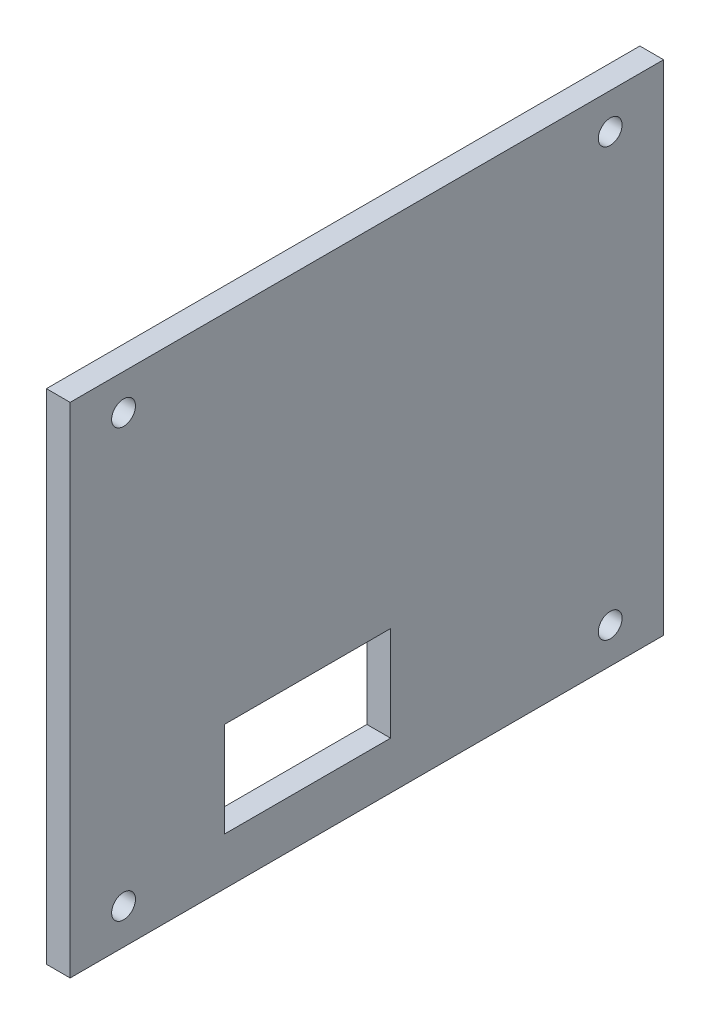
ISO-10303-21;
HEADER;
FILE_DESCRIPTION(('STEP AP214'),'2;1');
FILE_NAME('part.step','',(''),(''),'','','');
FILE_SCHEMA(('AUTOMOTIVE_DESIGN { 1 0 10303 214 1 1 1 1 }'));
ENDSEC;
DATA;
#1=APPLICATION_CONTEXT('core data for automotive mechanical design processes');
#2=APPLICATION_PROTOCOL_DEFINITION('international standard','automotive_design',2000,#1);
#3=PRODUCT_CONTEXT('',#1,'mechanical');
#4=PRODUCT('Part','Part','',(#3));
#5=PRODUCT_RELATED_PRODUCT_CATEGORY('part','',(#4));
#6=PRODUCT_DEFINITION_FORMATION('','',#4);
#7=PRODUCT_DEFINITION_CONTEXT('part definition',#1,'design');
#8=PRODUCT_DEFINITION('design','',#6,#7);
#9=PRODUCT_DEFINITION_SHAPE('','',#8);
#10=(LENGTH_UNIT() NAMED_UNIT(*) SI_UNIT(.MILLI.,.METRE.));
#11=(NAMED_UNIT(*) PLANE_ANGLE_UNIT() SI_UNIT($,.RADIAN.));
#12=(NAMED_UNIT(*) SI_UNIT($,.STERADIAN.) SOLID_ANGLE_UNIT());
#13=UNCERTAINTY_MEASURE_WITH_UNIT(LENGTH_MEASURE(1.E-05),#10,'distance_accuracy_value','');
#14=(GEOMETRIC_REPRESENTATION_CONTEXT(3) GLOBAL_UNCERTAINTY_ASSIGNED_CONTEXT((#13)) GLOBAL_UNIT_ASSIGNED_CONTEXT((#10,
#11,#12)) REPRESENTATION_CONTEXT('',''));
#15=CARTESIAN_POINT('',(0.,0.,0.));
#16=DIRECTION('',(0.,0.,1.));
#17=DIRECTION('',(1.,0.,0.));
#18=AXIS2_PLACEMENT_3D('',#15,#16,#17);
#19=CARTESIAN_POINT('',(2.,-22.,-25.));
#20=DIRECTION('',(0.,0.,1.));
#21=DIRECTION('',(1.,0.,0.));
#22=AXIS2_PLACEMENT_3D('',#19,#20,#21);
#23=PLANE('',#22);
#24=DIRECTION('',(0.,1.,0.));
#25=VECTOR('',#24,1.);
#26=CARTESIAN_POINT('',(2.,-22.,-25.));
#27=LINE('',#26,#25);
#28=CARTESIAN_POINT('',(2.,-21.0008036645774,-25.));
#29=VERTEX_POINT('',#28);
#30=CARTESIAN_POINT('',(2.,21.0015878345331,-25.));
#31=VERTEX_POINT('',#30);
#32=EDGE_CURVE('E113',#29,#31,#27,.T.);
#33=ORIENTED_EDGE('',*,*,#32,.F.);
#34=DIRECTION('',(1.,0.,0.));
#35=VECTOR('',#34,1.);
#36=CARTESIAN_POINT('',(-3.,-21.0008036645774,-25.));
#37=LINE('',#36,#35);
#38=CARTESIAN_POINT('',(0.,-21.0008036645774,-25.));
#39=VERTEX_POINT('',#38);
#40=EDGE_CURVE('E102',#39,#29,#37,.T.);
#41=ORIENTED_EDGE('',*,*,#40,.F.);
#42=DIRECTION('',(0.,1.,0.));
#43=VECTOR('',#42,1.);
#44=CARTESIAN_POINT('',(0.,-22.,-25.));
#45=LINE('',#44,#43);
#46=CARTESIAN_POINT('',(0.,21.0015878345331,-25.));
#47=VERTEX_POINT('',#46);
#48=EDGE_CURVE('E61',#39,#47,#45,.T.);
#49=ORIENTED_EDGE('',*,*,#48,.T.);
#50=DIRECTION('',(1.,0.,0.));
#51=VECTOR('',#50,1.);
#52=CARTESIAN_POINT('',(-3.,21.0015878345331,-25.));
#53=LINE('',#52,#51);
#54=EDGE_CURVE('E119',#47,#31,#53,.T.);
#55=ORIENTED_EDGE('',*,*,#54,.T.);
#56=EDGE_LOOP('',(#33,#41,#49,#55));
#57=FACE_BOUND('',#56,.T.);
#58=ADVANCED_FACE('F39',(#57),#23,.F.);
#59=CARTESIAN_POINT('',(2.,-22.,25.));
#60=DIRECTION('',(0.,0.,-1.));
#61=DIRECTION('',(-1.,0.,0.));
#62=AXIS2_PLACEMENT_3D('',#59,#60,#61);
#63=PLANE('',#62);
#64=DIRECTION('',(0.,-1.,0.));
#65=VECTOR('',#64,1.);
#66=CARTESIAN_POINT('',(0.,-22.,25.));
#67=LINE('',#66,#65);
#68=CARTESIAN_POINT('',(0.,21.0015878345331,25.));
#69=VERTEX_POINT('',#68);
#70=CARTESIAN_POINT('',(0.,-21.0008036645774,25.));
#71=VERTEX_POINT('',#70);
#72=EDGE_CURVE('E121',#69,#71,#67,.T.);
#73=ORIENTED_EDGE('',*,*,#72,.T.);
#74=DIRECTION('',(1.,0.,0.));
#75=VECTOR('',#74,1.);
#76=CARTESIAN_POINT('',(-3.,-21.0008036645774,25.));
#77=LINE('',#76,#75);
#78=CARTESIAN_POINT('',(2.,-21.0008036645774,25.));
#79=VERTEX_POINT('',#78);
#80=EDGE_CURVE('E53',#71,#79,#77,.T.);
#81=ORIENTED_EDGE('',*,*,#80,.T.);
#82=DIRECTION('',(0.,-1.,0.));
#83=VECTOR('',#82,1.);
#84=CARTESIAN_POINT('',(2.,-22.,25.));
#85=LINE('',#84,#83);
#86=CARTESIAN_POINT('',(2.,21.0015878345331,25.));
#87=VERTEX_POINT('',#86);
#88=EDGE_CURVE('E116',#87,#79,#85,.T.);
#89=ORIENTED_EDGE('',*,*,#88,.F.);
#90=DIRECTION('',(1.,0.,0.));
#91=VECTOR('',#90,1.);
#92=CARTESIAN_POINT('',(-3.,21.0015878345331,25.));
#93=LINE('',#92,#91);
#94=EDGE_CURVE('E139',#69,#87,#93,.T.);
#95=ORIENTED_EDGE('',*,*,#94,.F.);
#96=EDGE_LOOP('',(#73,#81,#89,#95));
#97=FACE_BOUND('',#96,.T.);
#98=ADVANCED_FACE('F143',(#97),#63,.F.);
#99=CARTESIAN_POINT('',(2.,0.,0.));
#100=DIRECTION('',(-1.,0.,0.));
#101=DIRECTION('',(0.,0.,1.));
#102=AXIS2_PLACEMENT_3D('',#99,#100,#101);
#103=PLANE('',#102);
#104=CARTESIAN_POINT('',(2.,-18.,20.4997928754972));
#105=DIRECTION('',(-1.,0.,0.));
#106=DIRECTION('',(0.,0.,1.));
#107=AXIS2_PLACEMENT_3D('',#104,#105,#106);
#108=CIRCLE('',#107,1.00359306352074);
#109=CARTESIAN_POINT('',(2.,-18.,21.5033859390179));
#110=VERTEX_POINT('',#109);
#111=EDGE_CURVE('E180',#110,#110,#108,.T.);
#112=ORIENTED_EDGE('',*,*,#111,.T.);
#113=EDGE_LOOP('',(#112));
#114=FACE_BOUND('',#113,.T.);
#115=CARTESIAN_POINT('',(2.,18.,-20.5002071245028));
#116=DIRECTION('',(-1.,0.,0.));
#117=DIRECTION('',(0.,0.,1.));
#118=AXIS2_PLACEMENT_3D('',#115,#116,#117);
#119=CIRCLE('',#118,1.00359306352074);
#120=CARTESIAN_POINT('',(2.,18.,-19.4966140609821));
#121=VERTEX_POINT('',#120);
#122=EDGE_CURVE('E232',#121,#121,#119,.T.);
#123=ORIENTED_EDGE('',*,*,#122,.T.);
#124=EDGE_LOOP('',(#123));
#125=FACE_BOUND('',#124,.T.);
#126=CARTESIAN_POINT('',(2.,-18.,-20.5002071245028));
#127=DIRECTION('',(-1.,0.,0.));
#128=DIRECTION('',(0.,0.,1.));
#129=AXIS2_PLACEMENT_3D('',#126,#127,#128);
#130=CIRCLE('',#129,1.00359306352074);
#131=CARTESIAN_POINT('',(2.,-18.,-19.4966140609821));
#132=VERTEX_POINT('',#131);
#133=EDGE_CURVE('E233',#132,#132,#130,.T.);
#134=ORIENTED_EDGE('',*,*,#133,.T.);
#135=EDGE_LOOP('',(#134));
#136=FACE_BOUND('',#135,.T.);
#137=CARTESIAN_POINT('',(2.,18.,20.4997928754972));
#138=DIRECTION('',(-1.,0.,0.));
#139=DIRECTION('',(0.,0.,1.));
#140=AXIS2_PLACEMENT_3D('',#137,#138,#139);
#141=CIRCLE('',#140,1.00359306352074);
#142=CARTESIAN_POINT('',(2.,18.,21.5033859390179));
#143=VERTEX_POINT('',#142);
#144=EDGE_CURVE('E133',#143,#143,#141,.T.);
#145=ORIENTED_EDGE('',*,*,#144,.T.);
#146=EDGE_LOOP('',(#145));
#147=FACE_BOUND('',#146,.T.);
#148=DIRECTION('',(0.,0.,-1.));
#149=VECTOR('',#148,1.);
#150=CARTESIAN_POINT('',(2.,-9.00000000000001,12.));
#151=LINE('',#150,#149);
#152=CARTESIAN_POINT('',(2.,-9.00000000000001,12.));
#153=VERTEX_POINT('',#152);
#154=CARTESIAN_POINT('',(2.,-9.00000000000001,-2.00000000000001));
#155=VERTEX_POINT('',#154);
#156=EDGE_CURVE('E189',#153,#155,#151,.T.);
#157=ORIENTED_EDGE('',*,*,#156,.T.);
#158=DIRECTION('',(0.,-1.,0.));
#159=VECTOR('',#158,1.);
#160=CARTESIAN_POINT('',(2.,-17.,-2.00000000000001));
#161=LINE('',#160,#159);
#162=CARTESIAN_POINT('',(2.,-17.,-2.00000000000001));
#163=VERTEX_POINT('',#162);
#164=EDGE_CURVE('E197',#155,#163,#161,.T.);
#165=ORIENTED_EDGE('',*,*,#164,.T.);
#166=DIRECTION('',(0.,0.,1.));
#167=VECTOR('',#166,1.);
#168=CARTESIAN_POINT('',(2.,-17.,12.));
#169=LINE('',#168,#167);
#170=CARTESIAN_POINT('',(2.,-17.,12.));
#171=VERTEX_POINT('',#170);
#172=EDGE_CURVE('E218',#163,#171,#169,.T.);
#173=ORIENTED_EDGE('',*,*,#172,.T.);
#174=DIRECTION('',(0.,1.,0.));
#175=VECTOR('',#174,1.);
#176=CARTESIAN_POINT('',(2.,-17.,12.));
#177=LINE('',#176,#175);
#178=EDGE_CURVE('E212',#171,#153,#177,.T.);
#179=ORIENTED_EDGE('',*,*,#178,.T.);
#180=EDGE_LOOP('',(#157,#165,#173,#179));
#181=FACE_BOUND('',#180,.T.);
#182=ORIENTED_EDGE('',*,*,#88,.T.);
#183=DIRECTION('',(0.,0.,1.));
#184=VECTOR('',#183,1.);
#185=CARTESIAN_POINT('',(2.,-21.0008036645774,25.));
#186=LINE('',#185,#184);
#187=EDGE_CURVE('E105',#29,#79,#186,.T.);
#188=ORIENTED_EDGE('',*,*,#187,.F.);
#189=ORIENTED_EDGE('',*,*,#32,.T.);
#190=DIRECTION('',(0.,0.,-1.));
#191=VECTOR('',#190,1.);
#192=CARTESIAN_POINT('',(2.,21.0015878345331,25.));
#193=LINE('',#192,#191);
#194=EDGE_CURVE('E145',#87,#31,#193,.T.);
#195=ORIENTED_EDGE('',*,*,#194,.F.);
#196=EDGE_LOOP('',(#182,#188,#189,#195));
#197=FACE_BOUND('',#196,.T.);
#198=ADVANCED_FACE('F111',(#114,#125,#136,#147,#181,#197),#103,.F.);
#199=CARTESIAN_POINT('',(0.,0.,0.));
#200=DIRECTION('',(-1.,0.,0.));
#201=DIRECTION('',(0.,0.,1.));
#202=AXIS2_PLACEMENT_3D('',#199,#200,#201);
#203=PLANE('',#202);
#204=DIRECTION('',(0.,0.,-1.));
#205=VECTOR('',#204,1.);
#206=CARTESIAN_POINT('',(0.,-21.0008036645774,0.));
#207=LINE('',#206,#205);
#208=EDGE_CURVE('E11',#71,#39,#207,.T.);
#209=ORIENTED_EDGE('',*,*,#208,.F.);
#210=ORIENTED_EDGE('',*,*,#72,.F.);
#211=DIRECTION('',(0.,0.,1.));
#212=VECTOR('',#211,1.);
#213=CARTESIAN_POINT('',(0.,21.0015878345331,0.));
#214=LINE('',#213,#212);
#215=EDGE_CURVE('E47',#47,#69,#214,.T.);
#216=ORIENTED_EDGE('',*,*,#215,.F.);
#217=ORIENTED_EDGE('',*,*,#48,.F.);
#218=EDGE_LOOP('',(#209,#210,#216,#217));
#219=FACE_BOUND('',#218,.T.);
#220=CARTESIAN_POINT('',(0.,-18.,20.4997928754972));
#221=DIRECTION('',(-1.,0.,0.));
#222=DIRECTION('',(0.,0.,1.));
#223=AXIS2_PLACEMENT_3D('',#220,#221,#222);
#224=CIRCLE('',#223,1.00359306352074);
#225=CARTESIAN_POINT('',(0.,-18.,21.5033859390179));
#226=VERTEX_POINT('',#225);
#227=EDGE_CURVE('E155',#226,#226,#224,.T.);
#228=ORIENTED_EDGE('',*,*,#227,.F.);
#229=EDGE_LOOP('',(#228));
#230=FACE_BOUND('',#229,.T.);
#231=CARTESIAN_POINT('',(0.,18.,-20.5002071245028));
#232=DIRECTION('',(-1.,0.,0.));
#233=DIRECTION('',(0.,0.,1.));
#234=AXIS2_PLACEMENT_3D('',#231,#232,#233);
#235=CIRCLE('',#234,1.00359306352074);
#236=CARTESIAN_POINT('',(0.,18.,-19.4966140609821));
#237=VERTEX_POINT('',#236);
#238=EDGE_CURVE('E159',#237,#237,#235,.T.);
#239=ORIENTED_EDGE('',*,*,#238,.F.);
#240=EDGE_LOOP('',(#239));
#241=FACE_BOUND('',#240,.T.);
#242=CARTESIAN_POINT('',(0.,-18.,-20.5002071245028));
#243=DIRECTION('',(-1.,0.,0.));
#244=DIRECTION('',(0.,0.,1.));
#245=AXIS2_PLACEMENT_3D('',#242,#243,#244);
#246=CIRCLE('',#245,1.00359306352074);
#247=CARTESIAN_POINT('',(0.,-18.,-19.4966140609821));
#248=VERTEX_POINT('',#247);
#249=EDGE_CURVE('E163',#248,#248,#246,.T.);
#250=ORIENTED_EDGE('',*,*,#249,.F.);
#251=EDGE_LOOP('',(#250));
#252=FACE_BOUND('',#251,.T.);
#253=CARTESIAN_POINT('',(0.,18.,20.4997928754972));
#254=DIRECTION('',(-1.,0.,0.));
#255=DIRECTION('',(0.,0.,1.));
#256=AXIS2_PLACEMENT_3D('',#253,#254,#255);
#257=CIRCLE('',#256,1.00359306352074);
#258=CARTESIAN_POINT('',(0.,18.,21.5033859390179));
#259=VERTEX_POINT('',#258);
#260=EDGE_CURVE('E167',#259,#259,#257,.T.);
#261=ORIENTED_EDGE('',*,*,#260,.F.);
#262=EDGE_LOOP('',(#261));
#263=FACE_BOUND('',#262,.T.);
#264=DIRECTION('',(0.,-1.,0.));
#265=VECTOR('',#264,1.);
#266=CARTESIAN_POINT('',(0.,-17.,-2.00000000000001));
#267=LINE('',#266,#265);
#268=CARTESIAN_POINT('',(0.,-9.00000000000001,-2.00000000000001));
#269=VERTEX_POINT('',#268);
#270=CARTESIAN_POINT('',(0.,-17.,-2.00000000000001));
#271=VERTEX_POINT('',#270);
#272=EDGE_CURVE('E171',#269,#271,#267,.T.);
#273=ORIENTED_EDGE('',*,*,#272,.F.);
#274=DIRECTION('',(0.,0.,-1.));
#275=VECTOR('',#274,1.);
#276=CARTESIAN_POINT('',(0.,-9.00000000000001,12.));
#277=LINE('',#276,#275);
#278=CARTESIAN_POINT('',(0.,-9.00000000000001,12.));
#279=VERTEX_POINT('',#278);
#280=EDGE_CURVE('E174',#279,#269,#277,.T.);
#281=ORIENTED_EDGE('',*,*,#280,.F.);
#282=DIRECTION('',(0.,1.,0.));
#283=VECTOR('',#282,1.);
#284=CARTESIAN_POINT('',(0.,-17.,12.));
#285=LINE('',#284,#283);
#286=CARTESIAN_POINT('',(0.,-17.,12.));
#287=VERTEX_POINT('',#286);
#288=EDGE_CURVE('E184',#287,#279,#285,.T.);
#289=ORIENTED_EDGE('',*,*,#288,.F.);
#290=DIRECTION('',(0.,0.,1.));
#291=VECTOR('',#290,1.);
#292=CARTESIAN_POINT('',(0.,-17.,12.));
#293=LINE('',#292,#291);
#294=EDGE_CURVE('E176',#271,#287,#293,.T.);
#295=ORIENTED_EDGE('',*,*,#294,.F.);
#296=EDGE_LOOP('',(#273,#281,#289,#295));
#297=FACE_BOUND('',#296,.T.);
#298=ADVANCED_FACE('F147',(#219,#230,#241,#252,#263,#297),#203,.T.);
#299=CARTESIAN_POINT('',(2.,-17.,-2.00000000000001));
#300=DIRECTION('',(0.,0.,-1.));
#301=DIRECTION('',(-1.,0.,0.));
#302=AXIS2_PLACEMENT_3D('',#299,#300,#301);
#303=PLANE('',#302);
#304=ORIENTED_EDGE('',*,*,#272,.T.);
#305=DIRECTION('',(-1.,0.,0.));
#306=VECTOR('',#305,1.);
#307=CARTESIAN_POINT('',(2.,-17.,-2.00000000000001));
#308=LINE('',#307,#306);
#309=EDGE_CURVE('E129',#163,#271,#308,.T.);
#310=ORIENTED_EDGE('',*,*,#309,.F.);
#311=ORIENTED_EDGE('',*,*,#164,.F.);
#312=DIRECTION('',(-1.,0.,0.));
#313=VECTOR('',#312,1.);
#314=CARTESIAN_POINT('',(2.,-9.00000000000001,-2.00000000000001));
#315=LINE('',#314,#313);
#316=EDGE_CURVE('E198',#155,#269,#315,.T.);
#317=ORIENTED_EDGE('',*,*,#316,.T.);
#318=EDGE_LOOP('',(#304,#310,#311,#317));
#319=FACE_BOUND('',#318,.T.);
#320=ADVANCED_FACE('F150',(#319),#303,.F.);
#321=CARTESIAN_POINT('',(2.,-9.00000000000001,12.));
#322=DIRECTION('',(0.,1.,0.));
#323=DIRECTION('',(0.,0.,1.));
#324=AXIS2_PLACEMENT_3D('',#321,#322,#323);
#325=PLANE('',#324);
#326=ORIENTED_EDGE('',*,*,#280,.T.);
#327=ORIENTED_EDGE('',*,*,#316,.F.);
#328=ORIENTED_EDGE('',*,*,#156,.F.);
#329=DIRECTION('',(-1.,0.,0.));
#330=VECTOR('',#329,1.);
#331=CARTESIAN_POINT('',(2.,-9.00000000000001,12.));
#332=LINE('',#331,#330);
#333=EDGE_CURVE('E201',#153,#279,#332,.T.);
#334=ORIENTED_EDGE('',*,*,#333,.T.);
#335=EDGE_LOOP('',(#326,#327,#328,#334));
#336=FACE_BOUND('',#335,.T.);
#337=ADVANCED_FACE('F277',(#336),#325,.F.);
#338=CARTESIAN_POINT('',(2.,-17.,12.));
#339=DIRECTION('',(0.,0.,1.));
#340=DIRECTION('',(1.,0.,0.));
#341=AXIS2_PLACEMENT_3D('',#338,#339,#340);
#342=PLANE('',#341);
#343=ORIENTED_EDGE('',*,*,#288,.T.);
#344=ORIENTED_EDGE('',*,*,#333,.F.);
#345=ORIENTED_EDGE('',*,*,#178,.F.);
#346=DIRECTION('',(-1.,0.,0.));
#347=VECTOR('',#346,1.);
#348=CARTESIAN_POINT('',(2.,-17.,12.));
#349=LINE('',#348,#347);
#350=EDGE_CURVE('E203',#171,#287,#349,.T.);
#351=ORIENTED_EDGE('',*,*,#350,.T.);
#352=EDGE_LOOP('',(#343,#344,#345,#351));
#353=FACE_BOUND('',#352,.T.);
#354=ADVANCED_FACE('F282',(#353),#342,.F.);
#355=CARTESIAN_POINT('',(2.,-17.,12.));
#356=DIRECTION('',(0.,-1.,0.));
#357=DIRECTION('',(0.,0.,-1.));
#358=AXIS2_PLACEMENT_3D('',#355,#356,#357);
#359=PLANE('',#358);
#360=ORIENTED_EDGE('',*,*,#294,.T.);
#361=ORIENTED_EDGE('',*,*,#350,.F.);
#362=ORIENTED_EDGE('',*,*,#172,.F.);
#363=ORIENTED_EDGE('',*,*,#309,.T.);
#364=EDGE_LOOP('',(#360,#361,#362,#363));
#365=FACE_BOUND('',#364,.T.);
#366=ADVANCED_FACE('F278',(#365),#359,.F.);
#367=CARTESIAN_POINT('',(2.,18.,20.4997928754972));
#368=DIRECTION('',(-1.,0.,0.));
#369=DIRECTION('',(0.,0.,1.));
#370=AXIS2_PLACEMENT_3D('',#367,#368,#369);
#371=CYLINDRICAL_SURFACE('',#370,1.00359306352074);
#372=ORIENTED_EDGE('',*,*,#144,.F.);
#373=EDGE_LOOP('',(#372));
#374=FACE_BOUND('',#373,.T.);
#375=ORIENTED_EDGE('',*,*,#260,.T.);
#376=EDGE_LOOP('',(#375));
#377=FACE_BOUND('',#376,.T.);
#378=ADVANCED_FACE('F281',(#374,#377),#371,.F.);
#379=CARTESIAN_POINT('',(2.,-18.,-20.5002071245028));
#380=DIRECTION('',(-1.,0.,0.));
#381=DIRECTION('',(0.,0.,1.));
#382=AXIS2_PLACEMENT_3D('',#379,#380,#381);
#383=CYLINDRICAL_SURFACE('',#382,1.00359306352074);
#384=ORIENTED_EDGE('',*,*,#133,.F.);
#385=EDGE_LOOP('',(#384));
#386=FACE_BOUND('',#385,.T.);
#387=ORIENTED_EDGE('',*,*,#249,.T.);
#388=EDGE_LOOP('',(#387));
#389=FACE_BOUND('',#388,.T.);
#390=ADVANCED_FACE('F260',(#386,#389),#383,.F.);
#391=CARTESIAN_POINT('',(2.,18.,-20.5002071245028));
#392=DIRECTION('',(-1.,0.,0.));
#393=DIRECTION('',(0.,0.,1.));
#394=AXIS2_PLACEMENT_3D('',#391,#392,#393);
#395=CYLINDRICAL_SURFACE('',#394,1.00359306352074);
#396=ORIENTED_EDGE('',*,*,#122,.F.);
#397=EDGE_LOOP('',(#396));
#398=FACE_BOUND('',#397,.T.);
#399=ORIENTED_EDGE('',*,*,#238,.T.);
#400=EDGE_LOOP('',(#399));
#401=FACE_BOUND('',#400,.T.);
#402=ADVANCED_FACE('F252',(#398,#401),#395,.F.);
#403=CARTESIAN_POINT('',(2.,-18.,20.4997928754972));
#404=DIRECTION('',(-1.,0.,0.));
#405=DIRECTION('',(0.,0.,1.));
#406=AXIS2_PLACEMENT_3D('',#403,#404,#405);
#407=CYLINDRICAL_SURFACE('',#406,1.00359306352074);
#408=ORIENTED_EDGE('',*,*,#111,.F.);
#409=EDGE_LOOP('',(#408));
#410=FACE_BOUND('',#409,.T.);
#411=ORIENTED_EDGE('',*,*,#227,.T.);
#412=EDGE_LOOP('',(#411));
#413=FACE_BOUND('',#412,.T.);
#414=ADVANCED_FACE('F250',(#410,#413),#407,.F.);
#415=CARTESIAN_POINT('',(-3.,21.0015878345331,25.));
#416=DIRECTION('',(0.,-1.,0.));
#417=DIRECTION('',(0.,0.,-1.));
#418=AXIS2_PLACEMENT_3D('',#415,#416,#417);
#419=PLANE('',#418);
#420=ORIENTED_EDGE('',*,*,#215,.T.);
#421=ORIENTED_EDGE('',*,*,#94,.T.);
#422=ORIENTED_EDGE('',*,*,#194,.T.);
#423=ORIENTED_EDGE('',*,*,#54,.F.);
#424=EDGE_LOOP('',(#420,#421,#422,#423));
#425=FACE_BOUND('',#424,.T.);
#426=ADVANCED_FACE('F138',(#425),#419,.F.);
#427=CARTESIAN_POINT('',(-3.,-21.0008036645774,25.));
#428=DIRECTION('',(0.,1.,0.));
#429=DIRECTION('',(0.,0.,1.));
#430=AXIS2_PLACEMENT_3D('',#427,#428,#429);
#431=PLANE('',#430);
#432=ORIENTED_EDGE('',*,*,#208,.T.);
#433=ORIENTED_EDGE('',*,*,#40,.T.);
#434=ORIENTED_EDGE('',*,*,#187,.T.);
#435=ORIENTED_EDGE('',*,*,#80,.F.);
#436=EDGE_LOOP('',(#432,#433,#434,#435));
#437=FACE_BOUND('',#436,.T.);
#438=ADVANCED_FACE('F104',(#437),#431,.F.);
#439=CLOSED_SHELL('',(#58,#98,#198,#298,#320,#337,#354,#366,#378,#390,#402,#414,#426,#438));
#440=MANIFOLD_SOLID_BREP('B2',#439);
#441=ADVANCED_BREP_SHAPE_REPRESENTATION('',(#18,#440),#14);
#442=SHAPE_DEFINITION_REPRESENTATION(#9,#441);
ENDSEC;
END-ISO-10303-21;
